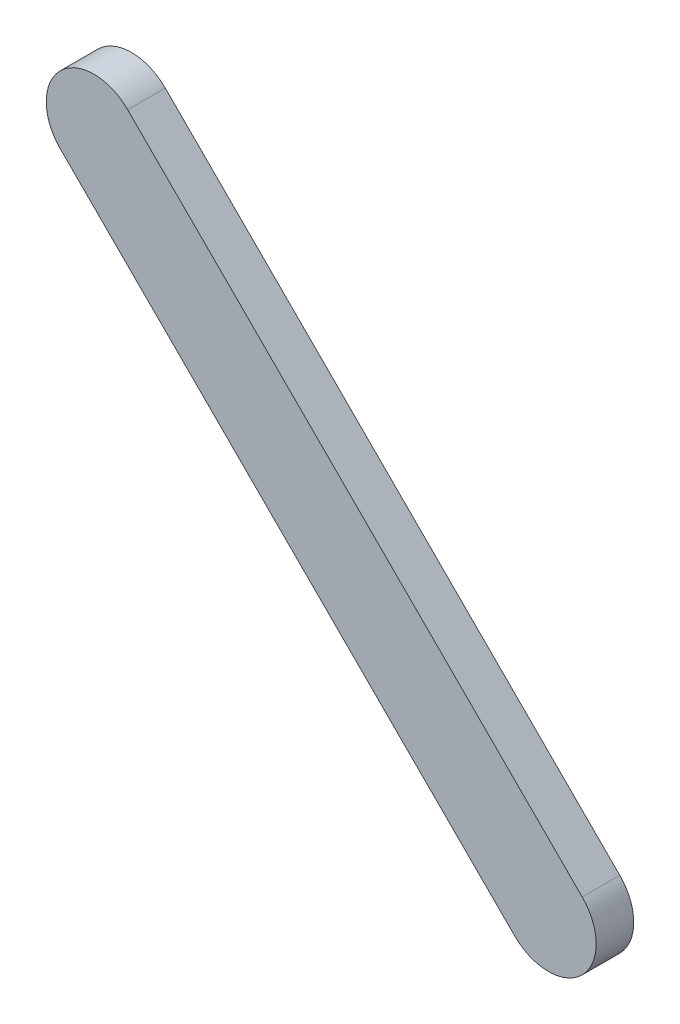
ISO-10303-21;
HEADER;
FILE_DESCRIPTION(('STEP AP214'),'2;1');
FILE_NAME('part.step','',(''),(''),'','','');
FILE_SCHEMA(('AUTOMOTIVE_DESIGN { 1 0 10303 214 1 1 1 1 }'));
ENDSEC;
DATA;
#1=APPLICATION_CONTEXT('core data for automotive mechanical design processes');
#2=APPLICATION_PROTOCOL_DEFINITION('international standard','automotive_design',2000,#1);
#3=PRODUCT_CONTEXT('',#1,'mechanical');
#4=PRODUCT('Part','Part','',(#3));
#5=PRODUCT_RELATED_PRODUCT_CATEGORY('part','',(#4));
#6=PRODUCT_DEFINITION_FORMATION('','',#4);
#7=PRODUCT_DEFINITION_CONTEXT('part definition',#1,'design');
#8=PRODUCT_DEFINITION('design','',#6,#7);
#9=PRODUCT_DEFINITION_SHAPE('','',#8);
#10=(LENGTH_UNIT() NAMED_UNIT(*) SI_UNIT(.MILLI.,.METRE.));
#11=(NAMED_UNIT(*) PLANE_ANGLE_UNIT() SI_UNIT($,.RADIAN.));
#12=(NAMED_UNIT(*) SI_UNIT($,.STERADIAN.) SOLID_ANGLE_UNIT());
#13=UNCERTAINTY_MEASURE_WITH_UNIT(LENGTH_MEASURE(1.E-05),#10,'distance_accuracy_value','');
#14=(GEOMETRIC_REPRESENTATION_CONTEXT(3) GLOBAL_UNCERTAINTY_ASSIGNED_CONTEXT((#13)) GLOBAL_UNIT_ASSIGNED_CONTEXT((#10,
#11,#12)) REPRESENTATION_CONTEXT('',''));
#15=CARTESIAN_POINT('',(0.,0.,0.));
#16=DIRECTION('',(0.,0.,1.));
#17=DIRECTION('',(1.,0.,0.));
#18=AXIS2_PLACEMENT_3D('',#15,#16,#17);
#19=CARTESIAN_POINT('',(123.2643966,68.67979406,0.));
#20=DIRECTION('',(0.707106781186545,0.70710678118655,0.));
#21=DIRECTION('',(0.70710678118655,-0.707106781186545,0.));
#22=AXIS2_PLACEMENT_3D('',#19,#20,#21);
#23=PLANE('',#22);
#24=DIRECTION('',(0.70710678118655,-0.707106781186545,0.));
#25=VECTOR('',#24,1.);
#26=CARTESIAN_POINT('',(123.2643966,68.67979406,0.1999996));
#27=LINE('',#26,#25);
#28=CARTESIAN_POINT('',(123.2643966,68.67979406,0.1999996));
#29=VERTEX_POINT('',#28);
#30=CARTESIAN_POINT('',(125.68379486,66.2603958,0.1999996));
#31=VERTEX_POINT('',#30);
#32=EDGE_CURVE('E11',#29,#31,#27,.T.);
#33=ORIENTED_EDGE('',*,*,#32,.F.);
#34=DIRECTION('',(0.,0.,1.));
#35=VECTOR('',#34,1.);
#36=CARTESIAN_POINT('',(123.2643966,68.67979406,0.));
#37=LINE('',#36,#35);
#38=CARTESIAN_POINT('',(123.2643966,68.67979406,0.));
#39=VERTEX_POINT('',#38);
#40=EDGE_CURVE('E24',#39,#29,#37,.T.);
#41=ORIENTED_EDGE('',*,*,#40,.F.);
#42=DIRECTION('',(0.70710678118655,-0.707106781186545,0.));
#43=VECTOR('',#42,1.);
#44=CARTESIAN_POINT('',(123.2643966,68.67979406,0.));
#45=LINE('',#44,#43);
#46=CARTESIAN_POINT('',(125.68379486,66.2603958,0.));
#47=VERTEX_POINT('',#46);
#48=EDGE_CURVE('E75',#39,#47,#45,.T.);
#49=ORIENTED_EDGE('',*,*,#48,.T.);
#50=DIRECTION('',(0.,0.,1.));
#51=VECTOR('',#50,1.);
#52=CARTESIAN_POINT('',(125.68379486,66.2603958,0.));
#53=LINE('',#52,#51);
#54=EDGE_CURVE('E37',#47,#31,#53,.T.);
#55=ORIENTED_EDGE('',*,*,#54,.T.);
#56=EDGE_LOOP('',(#33,#41,#49,#55));
#57=FACE_BOUND('',#56,.T.);
#58=ADVANCED_FACE('F17',(#57),#23,.F.);
#59=CARTESIAN_POINT('',(125.86339953,66.44000047,0.));
#60=DIRECTION('',(0.,0.,-1.));
#61=DIRECTION('',(-0.70710678118652,-0.707106781186576,0.));
#62=AXIS2_PLACEMENT_3D('',#59,#60,#61);
#63=CYLINDRICAL_SURFACE('',#62,0.253999360179539);
#64=CARTESIAN_POINT('',(125.86339953,66.44000047,0.1999996));
#65=DIRECTION('',(0.,0.,1.));
#66=DIRECTION('',(-0.70710678118652,-0.707106781186576,0.));
#67=AXIS2_PLACEMENT_3D('',#64,#65,#66);
#68=CIRCLE('',#67,0.253999360179539);
#69=CARTESIAN_POINT('',(126.0430042,66.61960514,0.1999996));
#70=VERTEX_POINT('',#69);
#71=EDGE_CURVE('E83',#31,#70,#68,.T.);
#72=ORIENTED_EDGE('',*,*,#71,.F.);
#73=ORIENTED_EDGE('',*,*,#54,.F.);
#74=CARTESIAN_POINT('',(125.86339953,66.44000047,0.));
#75=DIRECTION('',(0.,0.,1.));
#76=DIRECTION('',(-0.70710678118652,-0.707106781186576,0.));
#77=AXIS2_PLACEMENT_3D('',#74,#75,#76);
#78=CIRCLE('',#77,0.253999360179539);
#79=CARTESIAN_POINT('',(126.0430042,66.61960514,0.));
#80=VERTEX_POINT('',#79);
#81=EDGE_CURVE('E81',#47,#80,#78,.T.);
#82=ORIENTED_EDGE('',*,*,#81,.T.);
#83=DIRECTION('',(0.,0.,1.));
#84=VECTOR('',#83,1.);
#85=CARTESIAN_POINT('',(126.0430042,66.61960514,0.));
#86=LINE('',#85,#84);
#87=EDGE_CURVE('E67',#80,#70,#86,.T.);
#88=ORIENTED_EDGE('',*,*,#87,.T.);
#89=EDGE_LOOP('',(#72,#73,#82,#88));
#90=FACE_BOUND('',#89,.T.);
#91=ADVANCED_FACE('F89',(#90),#63,.T.);
#92=CARTESIAN_POINT('',(126.0430042,66.61960514,0.));
#93=DIRECTION('',(-0.707106781186548,-0.707106781186548,0.));
#94=DIRECTION('',(-0.707106781186548,0.707106781186548,0.));
#95=AXIS2_PLACEMENT_3D('',#92,#93,#94);
#96=PLANE('',#95);
#97=DIRECTION('',(-0.707106781186548,0.707106781186548,0.));
#98=VECTOR('',#97,1.);
#99=CARTESIAN_POINT('',(126.0430042,66.61960514,0.1999996));
#100=LINE('',#99,#98);
#101=CARTESIAN_POINT('',(123.62360594,69.0390034,0.1999996));
#102=VERTEX_POINT('',#101);
#103=EDGE_CURVE('E71',#70,#102,#100,.T.);
#104=ORIENTED_EDGE('',*,*,#103,.F.);
#105=ORIENTED_EDGE('',*,*,#87,.F.);
#106=DIRECTION('',(-0.707106781186548,0.707106781186548,0.));
#107=VECTOR('',#106,1.);
#108=CARTESIAN_POINT('',(126.0430042,66.61960514,0.));
#109=LINE('',#108,#107);
#110=CARTESIAN_POINT('',(123.62360594,69.0390034,0.));
#111=VERTEX_POINT('',#110);
#112=EDGE_CURVE('E63',#80,#111,#109,.T.);
#113=ORIENTED_EDGE('',*,*,#112,.T.);
#114=DIRECTION('',(0.,0.,1.));
#115=VECTOR('',#114,1.);
#116=CARTESIAN_POINT('',(123.62360594,69.0390034,0.));
#117=LINE('',#116,#115);
#118=EDGE_CURVE('E53',#111,#102,#117,.T.);
#119=ORIENTED_EDGE('',*,*,#118,.T.);
#120=EDGE_LOOP('',(#104,#105,#113,#119));
#121=FACE_BOUND('',#120,.T.);
#122=ADVANCED_FACE('F66',(#121),#96,.F.);
#123=CARTESIAN_POINT('',(123.44400127,68.85939873,0.));
#124=DIRECTION('',(0.,0.,-1.));
#125=DIRECTION('',(0.70710678118652,0.707106781186576,0.));
#126=AXIS2_PLACEMENT_3D('',#123,#124,#125);
#127=CYLINDRICAL_SURFACE('',#126,0.253999360179546);
#128=CARTESIAN_POINT('',(123.44400127,68.85939873,0.1999996));
#129=DIRECTION('',(0.,0.,1.));
#130=DIRECTION('',(0.70710678118652,0.707106781186576,0.));
#131=AXIS2_PLACEMENT_3D('',#128,#129,#130);
#132=CIRCLE('',#131,0.253999360179546);
#133=EDGE_CURVE('E59',#102,#29,#132,.T.);
#134=ORIENTED_EDGE('',*,*,#133,.F.);
#135=ORIENTED_EDGE('',*,*,#118,.F.);
#136=CARTESIAN_POINT('',(123.44400127,68.85939873,0.));
#137=DIRECTION('',(0.,0.,1.));
#138=DIRECTION('',(0.70710678118652,0.707106781186576,0.));
#139=AXIS2_PLACEMENT_3D('',#136,#137,#138);
#140=CIRCLE('',#139,0.253999360179546);
#141=EDGE_CURVE('E57',#111,#39,#140,.T.);
#142=ORIENTED_EDGE('',*,*,#141,.T.);
#143=ORIENTED_EDGE('',*,*,#40,.T.);
#144=EDGE_LOOP('',(#134,#135,#142,#143));
#145=FACE_BOUND('',#144,.T.);
#146=ADVANCED_FACE('F55',(#145),#127,.T.);
#147=CARTESIAN_POINT('',(123.2643966,68.67979406,0.));
#148=DIRECTION('',(0.,0.,-1.));
#149=DIRECTION('',(-1.,0.,0.));
#150=AXIS2_PLACEMENT_3D('',#147,#148,#149);
#151=PLANE('',#150);
#152=ORIENTED_EDGE('',*,*,#141,.F.);
#153=ORIENTED_EDGE('',*,*,#112,.F.);
#154=ORIENTED_EDGE('',*,*,#81,.F.);
#155=ORIENTED_EDGE('',*,*,#48,.F.);
#156=EDGE_LOOP('',(#152,#153,#154,#155));
#157=FACE_BOUND('',#156,.T.);
#158=ADVANCED_FACE('F74',(#157),#151,.T.);
#159=CARTESIAN_POINT('',(123.2643966,68.67979406,0.1999996));
#160=DIRECTION('',(0.,0.,-1.));
#161=DIRECTION('',(-1.,0.,0.));
#162=AXIS2_PLACEMENT_3D('',#159,#160,#161);
#163=PLANE('',#162);
#164=ORIENTED_EDGE('',*,*,#32,.T.);
#165=ORIENTED_EDGE('',*,*,#71,.T.);
#166=ORIENTED_EDGE('',*,*,#103,.T.);
#167=ORIENTED_EDGE('',*,*,#133,.T.);
#168=EDGE_LOOP('',(#164,#165,#166,#167));
#169=FACE_BOUND('',#168,.T.);
#170=ADVANCED_FACE('F91',(#169),#163,.F.);
#171=CLOSED_SHELL('',(#58,#91,#122,#146,#158,#170));
#172=MANIFOLD_SOLID_BREP('B1',#171);
#173=ADVANCED_BREP_SHAPE_REPRESENTATION('',(#18,#172),#14);
#174=SHAPE_DEFINITION_REPRESENTATION(#9,#173);
ENDSEC;
END-ISO-10303-21;
